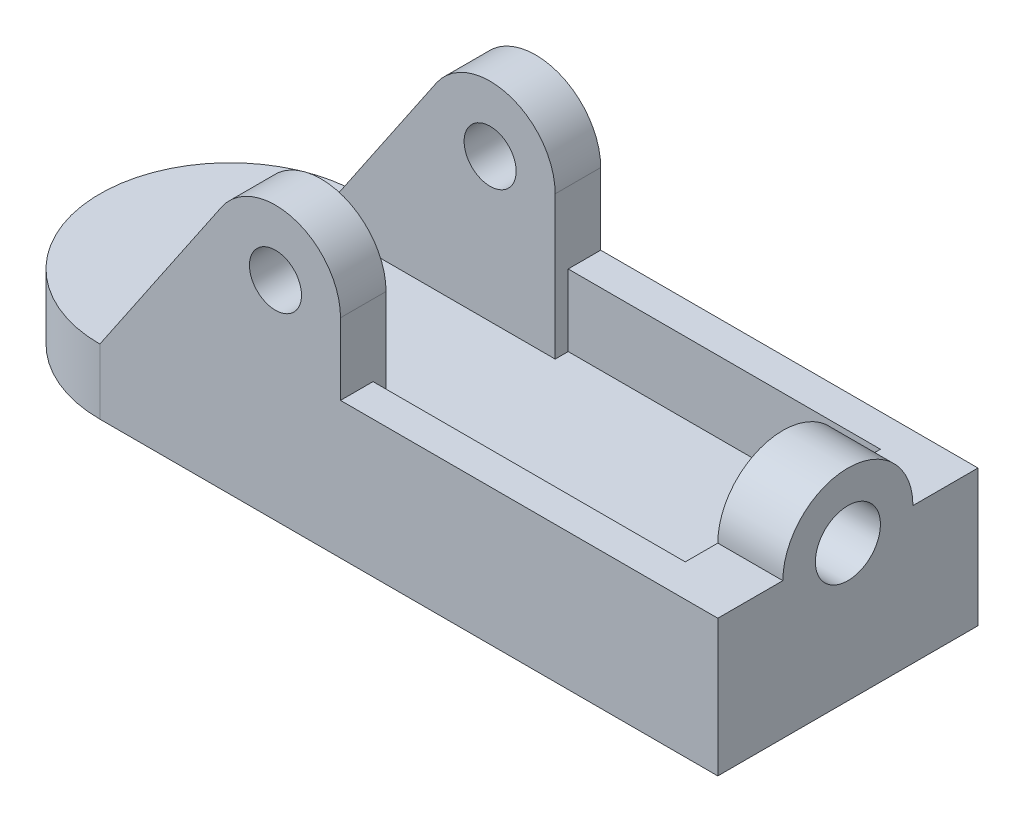
ISO-10303-21;
HEADER;
FILE_DESCRIPTION(('STEP AP214'),'2;1');
FILE_NAME('part.step','',(''),(''),'','','');
FILE_SCHEMA(('AUTOMOTIVE_DESIGN { 1 0 10303 214 1 1 1 1 }'));
ENDSEC;
DATA;
#1=APPLICATION_CONTEXT('core data for automotive mechanical design processes');
#2=APPLICATION_PROTOCOL_DEFINITION('international standard','automotive_design',2000,#1);
#3=PRODUCT_CONTEXT('',#1,'mechanical');
#4=PRODUCT('Part','Part','',(#3));
#5=PRODUCT_RELATED_PRODUCT_CATEGORY('part','',(#4));
#6=PRODUCT_DEFINITION_FORMATION('','',#4);
#7=PRODUCT_DEFINITION_CONTEXT('part definition',#1,'design');
#8=PRODUCT_DEFINITION('design','',#6,#7);
#9=PRODUCT_DEFINITION_SHAPE('','',#8);
#10=(LENGTH_UNIT() NAMED_UNIT(*) SI_UNIT(.MILLI.,.METRE.));
#11=(NAMED_UNIT(*) PLANE_ANGLE_UNIT() SI_UNIT($,.RADIAN.));
#12=(NAMED_UNIT(*) SI_UNIT($,.STERADIAN.) SOLID_ANGLE_UNIT());
#13=UNCERTAINTY_MEASURE_WITH_UNIT(LENGTH_MEASURE(1.E-05),#10,'distance_accuracy_value','');
#14=(GEOMETRIC_REPRESENTATION_CONTEXT(3) GLOBAL_UNCERTAINTY_ASSIGNED_CONTEXT((#13)) GLOBAL_UNIT_ASSIGNED_CONTEXT((#10,
#11,#12)) REPRESENTATION_CONTEXT('',''));
#15=CARTESIAN_POINT('',(0.,0.,0.));
#16=DIRECTION('',(0.,0.,1.));
#17=DIRECTION('',(1.,0.,0.));
#18=AXIS2_PLACEMENT_3D('',#15,#16,#17);
#19=CARTESIAN_POINT('',(0.,10.,0.));
#20=DIRECTION('',(0.,1.,0.));
#21=DIRECTION('',(0.,0.,1.));
#22=AXIS2_PLACEMENT_3D('',#19,#20,#21);
#23=PLANE('',#22);
#24=DIRECTION('',(0.,0.,1.));
#25=VECTOR('',#24,1.);
#26=CARTESIAN_POINT('',(85.,10.,10.));
#27=LINE('',#26,#25);
#28=CARTESIAN_POINT('',(85.,10.,-15.));
#29=VERTEX_POINT('',#28);
#30=CARTESIAN_POINT('',(85.,10.,15.));
#31=VERTEX_POINT('',#30);
#32=EDGE_CURVE('E234',#29,#31,#27,.T.);
#33=ORIENTED_EDGE('',*,*,#32,.F.);
#34=DIRECTION('',(-1.,0.,0.));
#35=VECTOR('',#34,1.);
#36=CARTESIAN_POINT('',(85.,10.,-15.));
#37=LINE('',#36,#35);
#38=CARTESIAN_POINT('',(37.,10.,-15.));
#39=VERTEX_POINT('',#38);
#40=EDGE_CURVE('E215',#29,#39,#37,.T.);
#41=ORIENTED_EDGE('',*,*,#40,.T.);
#42=DIRECTION('',(0.,0.,-1.));
#43=VECTOR('',#42,1.);
#44=CARTESIAN_POINT('',(37.,10.,-13.));
#45=LINE('',#44,#43);
#46=CARTESIAN_POINT('',(37.,10.,-13.));
#47=VERTEX_POINT('',#46);
#48=EDGE_CURVE('E284',#47,#39,#45,.T.);
#49=ORIENTED_EDGE('',*,*,#48,.F.);
#50=DIRECTION('',(1.,0.,0.));
#51=VECTOR('',#50,1.);
#52=CARTESIAN_POINT('',(0.,10.,-13.));
#53=LINE('',#52,#51);
#54=CARTESIAN_POINT('',(0.,10.,-13.));
#55=VERTEX_POINT('',#54);
#56=EDGE_CURVE('E271',#55,#47,#53,.T.);
#57=ORIENTED_EDGE('',*,*,#56,.F.);
#58=DIRECTION('',(0.,0.,-1.));
#59=VECTOR('',#58,1.);
#60=CARTESIAN_POINT('',(0.,10.,-13.));
#61=LINE('',#60,#59);
#62=CARTESIAN_POINT('',(0.,10.,-20.));
#63=VERTEX_POINT('',#62);
#64=EDGE_CURVE('E280',#55,#63,#61,.T.);
#65=ORIENTED_EDGE('',*,*,#64,.T.);
#66=CARTESIAN_POINT('',(0.,10.,0.));
#67=DIRECTION('',(0.,1.,0.));
#68=DIRECTION('',(0.,0.,1.));
#69=AXIS2_PLACEMENT_3D('',#66,#67,#68);
#70=CIRCLE('',#69,20.);
#71=CARTESIAN_POINT('',(0.,10.,20.));
#72=VERTEX_POINT('',#71);
#73=EDGE_CURVE('E358',#63,#72,#70,.T.);
#74=ORIENTED_EDGE('',*,*,#73,.T.);
#75=DIRECTION('',(0.,0.,1.));
#76=VECTOR('',#75,1.);
#77=CARTESIAN_POINT('',(0.,10.,13.));
#78=LINE('',#77,#76);
#79=CARTESIAN_POINT('',(0.,10.,13.));
#80=VERTEX_POINT('',#79);
#81=EDGE_CURVE('E311',#80,#72,#78,.T.);
#82=ORIENTED_EDGE('',*,*,#81,.F.);
#83=DIRECTION('',(1.,0.,0.));
#84=VECTOR('',#83,1.);
#85=CARTESIAN_POINT('',(0.,10.,13.));
#86=LINE('',#85,#84);
#87=CARTESIAN_POINT('',(37.,10.,13.));
#88=VERTEX_POINT('',#87);
#89=EDGE_CURVE('E301',#80,#88,#86,.T.);
#90=ORIENTED_EDGE('',*,*,#89,.T.);
#91=DIRECTION('',(0.,0.,1.));
#92=VECTOR('',#91,1.);
#93=CARTESIAN_POINT('',(37.,10.,13.));
#94=LINE('',#93,#92);
#95=CARTESIAN_POINT('',(37.,10.,15.));
#96=VERTEX_POINT('',#95);
#97=EDGE_CURVE('E324',#88,#96,#94,.T.);
#98=ORIENTED_EDGE('',*,*,#97,.T.);
#99=DIRECTION('',(-1.,0.,0.));
#100=VECTOR('',#99,1.);
#101=CARTESIAN_POINT('',(85.,10.,15.));
#102=LINE('',#101,#100);
#103=EDGE_CURVE('E68',#31,#96,#102,.T.);
#104=ORIENTED_EDGE('',*,*,#103,.F.);
#105=EDGE_LOOP('',(#33,#41,#49,#57,#65,#74,#82,#90,#98,#104));
#106=FACE_BOUND('',#105,.T.);
#107=DIRECTION('',(1.,0.,0.));
#108=VECTOR('',#107,1.);
#109=CARTESIAN_POINT('',(0.,10.,5.));
#110=LINE('',#109,#108);
#111=CARTESIAN_POINT('',(0.,10.,5.));
#112=VERTEX_POINT('',#111);
#113=CARTESIAN_POINT('',(16.8306805124505,10.,5.));
#114=VERTEX_POINT('',#113);
#115=EDGE_CURVE('E329',#112,#114,#110,.T.);
#116=ORIENTED_EDGE('',*,*,#115,.F.);
#117=CARTESIAN_POINT('',(0.,10.,0.));
#118=DIRECTION('',(0.,1.,0.));
#119=DIRECTION('',(0.,0.,1.));
#120=AXIS2_PLACEMENT_3D('',#117,#118,#119);
#121=CIRCLE('',#120,5.);
#122=CARTESIAN_POINT('',(0.,10.,-5.));
#123=VERTEX_POINT('',#122);
#124=EDGE_CURVE('E327',#123,#112,#121,.T.);
#125=ORIENTED_EDGE('',*,*,#124,.F.);
#126=DIRECTION('',(-1.,0.,0.));
#127=VECTOR('',#126,1.);
#128=CARTESIAN_POINT('',(0.,10.,-5.));
#129=LINE('',#128,#127);
#130=CARTESIAN_POINT('',(16.8306805124505,10.,-5.));
#131=VERTEX_POINT('',#130);
#132=EDGE_CURVE('E335',#131,#123,#129,.T.);
#133=ORIENTED_EDGE('',*,*,#132,.F.);
#134=CARTESIAN_POINT('',(16.8306805124505,10.,0.));
#135=DIRECTION('',(0.,1.,0.));
#136=DIRECTION('',(0.,0.,1.));
#137=AXIS2_PLACEMENT_3D('',#134,#135,#136);
#138=CIRCLE('',#137,5.);
#139=EDGE_CURVE('E332',#114,#131,#138,.T.);
#140=ORIENTED_EDGE('',*,*,#139,.F.);
#141=EDGE_LOOP('',(#116,#125,#133,#140));
#142=FACE_BOUND('',#141,.T.);
#143=ADVANCED_FACE('F45',(#106,#142),#23,.T.);
#144=CARTESIAN_POINT('',(37.,10.,13.));
#145=DIRECTION('',(1.,0.,0.));
#146=DIRECTION('',(0.,0.,-1.));
#147=AXIS2_PLACEMENT_3D('',#144,#145,#146);
#148=PLANE('',#147);
#149=DIRECTION('',(0.,0.,1.));
#150=VECTOR('',#149,1.);
#151=CARTESIAN_POINT('',(37.,21.,15.));
#152=LINE('',#151,#150);
#153=CARTESIAN_POINT('',(37.,21.,15.));
#154=VERTEX_POINT('',#153);
#155=CARTESIAN_POINT('',(37.,21.,20.));
#156=VERTEX_POINT('',#155);
#157=EDGE_CURVE('E235',#154,#156,#152,.T.);
#158=ORIENTED_EDGE('',*,*,#157,.F.);
#159=DIRECTION('',(0.,-1.,0.));
#160=VECTOR('',#159,1.);
#161=CARTESIAN_POINT('',(37.,21.,15.));
#162=LINE('',#161,#160);
#163=EDGE_CURVE('E249',#154,#96,#162,.T.);
#164=ORIENTED_EDGE('',*,*,#163,.T.);
#165=ORIENTED_EDGE('',*,*,#97,.F.);
#166=DIRECTION('',(0.,1.,0.));
#167=VECTOR('',#166,1.);
#168=CARTESIAN_POINT('',(37.,10.,13.));
#169=LINE('',#168,#167);
#170=CARTESIAN_POINT('',(37.,32.,13.));
#171=VERTEX_POINT('',#170);
#172=EDGE_CURVE('E305',#88,#171,#169,.T.);
#173=ORIENTED_EDGE('',*,*,#172,.T.);
#174=DIRECTION('',(0.,0.,1.));
#175=VECTOR('',#174,1.);
#176=CARTESIAN_POINT('',(37.,32.,13.));
#177=LINE('',#176,#175);
#178=CARTESIAN_POINT('',(37.,32.,20.));
#179=VERTEX_POINT('',#178);
#180=EDGE_CURVE('E321',#171,#179,#177,.T.);
#181=ORIENTED_EDGE('',*,*,#180,.T.);
#182=DIRECTION('',(0.,1.,0.));
#183=VECTOR('',#182,1.);
#184=CARTESIAN_POINT('',(37.,10.,20.));
#185=LINE('',#184,#183);
#186=EDGE_CURVE('E314',#156,#179,#185,.T.);
#187=ORIENTED_EDGE('',*,*,#186,.F.);
#188=EDGE_LOOP('',(#158,#164,#165,#173,#181,#187));
#189=FACE_BOUND('',#188,.T.);
#190=ADVANCED_FACE('F424',(#189),#148,.T.);
#191=CARTESIAN_POINT('',(0.,0.,0.));
#192=DIRECTION('',(0.,1.,0.));
#193=DIRECTION('',(0.,0.,1.));
#194=AXIS2_PLACEMENT_3D('',#191,#192,#193);
#195=PLANE('',#194);
#196=CARTESIAN_POINT('',(0.,0.,0.));
#197=DIRECTION('',(0.,1.,0.));
#198=DIRECTION('',(0.,0.,1.));
#199=AXIS2_PLACEMENT_3D('',#196,#197,#198);
#200=CIRCLE('',#199,20.);
#201=CARTESIAN_POINT('',(0.,0.,-20.));
#202=VERTEX_POINT('',#201);
#203=CARTESIAN_POINT('',(0.,0.,20.));
#204=VERTEX_POINT('',#203);
#205=EDGE_CURVE('E357',#202,#204,#200,.T.);
#206=ORIENTED_EDGE('',*,*,#205,.F.);
#207=DIRECTION('',(-1.,0.,0.));
#208=VECTOR('',#207,1.);
#209=CARTESIAN_POINT('',(95.,0.,-20.));
#210=LINE('',#209,#208);
#211=CARTESIAN_POINT('',(95.,0.,-20.));
#212=VERTEX_POINT('',#211);
#213=EDGE_CURVE('E362',#212,#202,#210,.T.);
#214=ORIENTED_EDGE('',*,*,#213,.F.);
#215=DIRECTION('',(0.,0.,-1.));
#216=VECTOR('',#215,1.);
#217=CARTESIAN_POINT('',(95.,0.,20.));
#218=LINE('',#217,#216);
#219=CARTESIAN_POINT('',(95.,0.,20.));
#220=VERTEX_POINT('',#219);
#221=EDGE_CURVE('E367',#220,#212,#218,.T.);
#222=ORIENTED_EDGE('',*,*,#221,.F.);
#223=DIRECTION('',(1.,0.,0.));
#224=VECTOR('',#223,1.);
#225=CARTESIAN_POINT('',(0.,0.,20.));
#226=LINE('',#225,#224);
#227=EDGE_CURVE('E365',#204,#220,#226,.T.);
#228=ORIENTED_EDGE('',*,*,#227,.F.);
#229=EDGE_LOOP('',(#206,#214,#222,#228));
#230=FACE_BOUND('',#229,.T.);
#231=CARTESIAN_POINT('',(0.,0.,0.));
#232=DIRECTION('',(0.,1.,0.));
#233=DIRECTION('',(0.,0.,1.));
#234=AXIS2_PLACEMENT_3D('',#231,#232,#233);
#235=CIRCLE('',#234,5.);
#236=CARTESIAN_POINT('',(0.,0.,-5.));
#237=VERTEX_POINT('',#236);
#238=CARTESIAN_POINT('',(0.,0.,5.));
#239=VERTEX_POINT('',#238);
#240=EDGE_CURVE('E320',#237,#239,#235,.T.);
#241=ORIENTED_EDGE('',*,*,#240,.T.);
#242=DIRECTION('',(1.,0.,0.));
#243=VECTOR('',#242,1.);
#244=CARTESIAN_POINT('',(0.,0.,5.));
#245=LINE('',#244,#243);
#246=CARTESIAN_POINT('',(16.8306805124505,0.,5.));
#247=VERTEX_POINT('',#246);
#248=EDGE_CURVE('E340',#239,#247,#245,.T.);
#249=ORIENTED_EDGE('',*,*,#248,.T.);
#250=CARTESIAN_POINT('',(16.8306805124505,0.,0.));
#251=DIRECTION('',(0.,1.,0.));
#252=DIRECTION('',(0.,0.,1.));
#253=AXIS2_PLACEMENT_3D('',#250,#251,#252);
#254=CIRCLE('',#253,5.);
#255=CARTESIAN_POINT('',(16.8306805124505,0.,-5.));
#256=VERTEX_POINT('',#255);
#257=EDGE_CURVE('E343',#247,#256,#254,.T.);
#258=ORIENTED_EDGE('',*,*,#257,.T.);
#259=DIRECTION('',(-1.,0.,0.));
#260=VECTOR('',#259,1.);
#261=CARTESIAN_POINT('',(0.,0.,-5.));
#262=LINE('',#261,#260);
#263=EDGE_CURVE('E330',#256,#237,#262,.T.);
#264=ORIENTED_EDGE('',*,*,#263,.T.);
#265=EDGE_LOOP('',(#241,#249,#258,#264));
#266=FACE_BOUND('',#265,.T.);
#267=ADVANCED_FACE('F385',(#230,#266),#195,.F.);
#268=CARTESIAN_POINT('',(0.,10.,0.));
#269=DIRECTION('',(0.,-1.,0.));
#270=DIRECTION('',(0.,0.,-1.));
#271=AXIS2_PLACEMENT_3D('',#268,#269,#270);
#272=CYLINDRICAL_SURFACE('',#271,20.);
#273=ORIENTED_EDGE('',*,*,#205,.T.);
#274=DIRECTION('',(0.,-1.,0.));
#275=VECTOR('',#274,1.);
#276=CARTESIAN_POINT('',(0.,10.,20.));
#277=LINE('',#276,#275);
#278=EDGE_CURVE('E13',#72,#204,#277,.T.);
#279=ORIENTED_EDGE('',*,*,#278,.F.);
#280=ORIENTED_EDGE('',*,*,#73,.F.);
#281=DIRECTION('',(0.,-1.,0.));
#282=VECTOR('',#281,1.);
#283=CARTESIAN_POINT('',(0.,10.,-20.));
#284=LINE('',#283,#282);
#285=EDGE_CURVE('E361',#63,#202,#284,.T.);
#286=ORIENTED_EDGE('',*,*,#285,.T.);
#287=EDGE_LOOP('',(#273,#279,#280,#286));
#288=FACE_BOUND('',#287,.T.);
#289=ADVANCED_FACE('F47',(#288),#272,.T.);
#290=CARTESIAN_POINT('',(0.,10.,20.));
#291=DIRECTION('',(0.,0.,-1.));
#292=DIRECTION('',(-1.,0.,0.));
#293=AXIS2_PLACEMENT_3D('',#290,#291,#292);
#294=PLANE('',#293);
#295=DIRECTION('',(0.,-1.,0.));
#296=VECTOR('',#295,1.);
#297=CARTESIAN_POINT('',(95.,10.,20.));
#298=LINE('',#297,#296);
#299=CARTESIAN_POINT('',(95.,21.,20.));
#300=VERTEX_POINT('',#299);
#301=EDGE_CURVE('E53',#300,#220,#298,.T.);
#302=ORIENTED_EDGE('',*,*,#301,.F.);
#303=DIRECTION('',(1.,0.,0.));
#304=VECTOR('',#303,1.);
#305=CARTESIAN_POINT('',(37.,21.,20.));
#306=LINE('',#305,#304);
#307=EDGE_CURVE('E238',#156,#300,#306,.T.);
#308=ORIENTED_EDGE('',*,*,#307,.F.);
#309=ORIENTED_EDGE('',*,*,#186,.T.);
#310=CARTESIAN_POINT('',(27.,32.,20.));
#311=DIRECTION('',(0.,0.,1.));
#312=DIRECTION('',(1.,0.,0.));
#313=AXIS2_PLACEMENT_3D('',#310,#311,#312);
#314=CIRCLE('',#313,10.);
#315=CARTESIAN_POINT('',(18.7233602475273,37.6122396962165,20.));
#316=VERTEX_POINT('',#315);
#317=EDGE_CURVE('E302',#179,#316,#314,.T.);
#318=ORIENTED_EDGE('',*,*,#317,.T.);
#319=DIRECTION('',(-0.561223969621651,-0.827663975247271,0.));
#320=VECTOR('',#319,1.);
#321=CARTESIAN_POINT('',(0.,10.,20.));
#322=LINE('',#321,#320);
#323=EDGE_CURVE('E295',#316,#72,#322,.T.);
#324=ORIENTED_EDGE('',*,*,#323,.T.);
#325=ORIENTED_EDGE('',*,*,#278,.T.);
#326=ORIENTED_EDGE('',*,*,#227,.T.);
#327=EDGE_LOOP('',(#302,#308,#309,#318,#324,#325,#326));
#328=FACE_BOUND('',#327,.T.);
#329=CARTESIAN_POINT('',(27.,32.,20.));
#330=DIRECTION('',(0.,0.,1.));
#331=DIRECTION('',(1.,0.,0.));
#332=AXIS2_PLACEMENT_3D('',#329,#330,#331);
#333=CIRCLE('',#332,4.);
#334=CARTESIAN_POINT('',(31.,32.,20.));
#335=VERTEX_POINT('',#334);
#336=EDGE_CURVE('E283',#335,#335,#333,.T.);
#337=ORIENTED_EDGE('',*,*,#336,.F.);
#338=EDGE_LOOP('',(#337));
#339=FACE_BOUND('',#338,.T.);
#340=ADVANCED_FACE('F420',(#328,#339),#294,.F.);
#341=CARTESIAN_POINT('',(95.,10.,20.));
#342=DIRECTION('',(-1.,0.,0.));
#343=DIRECTION('',(0.,0.,1.));
#344=AXIS2_PLACEMENT_3D('',#341,#342,#343);
#345=PLANE('',#344);
#346=ORIENTED_EDGE('',*,*,#221,.T.);
#347=DIRECTION('',(0.,-1.,0.));
#348=VECTOR('',#347,1.);
#349=CARTESIAN_POINT('',(95.,10.,-20.));
#350=LINE('',#349,#348);
#351=CARTESIAN_POINT('',(95.,21.,-20.));
#352=VERTEX_POINT('',#351);
#353=EDGE_CURVE('E372',#352,#212,#350,.T.);
#354=ORIENTED_EDGE('',*,*,#353,.F.);
#355=DIRECTION('',(0.,0.,1.));
#356=VECTOR('',#355,1.);
#357=CARTESIAN_POINT('',(95.,21.,-20.));
#358=LINE('',#357,#356);
#359=CARTESIAN_POINT('',(95.,21.,-10.));
#360=VERTEX_POINT('',#359);
#361=EDGE_CURVE('E208',#352,#360,#358,.T.);
#362=ORIENTED_EDGE('',*,*,#361,.T.);
#363=CARTESIAN_POINT('',(95.,21.,0.));
#364=DIRECTION('',(1.,0.,0.));
#365=DIRECTION('',(0.,0.,1.));
#366=AXIS2_PLACEMENT_3D('',#363,#364,#365);
#367=CIRCLE('',#366,10.);
#368=CARTESIAN_POINT('',(95.,21.,10.));
#369=VERTEX_POINT('',#368);
#370=EDGE_CURVE('E207',#360,#369,#367,.T.);
#371=ORIENTED_EDGE('',*,*,#370,.T.);
#372=DIRECTION('',(0.,0.,-1.));
#373=VECTOR('',#372,1.);
#374=CARTESIAN_POINT('',(95.,21.,20.));
#375=LINE('',#374,#373);
#376=EDGE_CURVE('E241',#300,#369,#375,.T.);
#377=ORIENTED_EDGE('',*,*,#376,.F.);
#378=ORIENTED_EDGE('',*,*,#301,.T.);
#379=EDGE_LOOP('',(#346,#354,#362,#371,#377,#378));
#380=FACE_BOUND('',#379,.T.);
#381=CARTESIAN_POINT('',(95.,21.,0.));
#382=DIRECTION('',(1.,0.,0.));
#383=DIRECTION('',(0.,0.,-1.));
#384=AXIS2_PLACEMENT_3D('',#381,#382,#383);
#385=CIRCLE('',#384,5.);
#386=CARTESIAN_POINT('',(95.,21.,-5.));
#387=VERTEX_POINT('',#386);
#388=EDGE_CURVE('E223',#387,#387,#385,.T.);
#389=ORIENTED_EDGE('',*,*,#388,.F.);
#390=EDGE_LOOP('',(#389));
#391=FACE_BOUND('',#390,.T.);
#392=ADVANCED_FACE('F378',(#380,#391),#345,.F.);
#393=CARTESIAN_POINT('',(95.,10.,-20.));
#394=DIRECTION('',(0.,0.,1.));
#395=DIRECTION('',(1.,0.,0.));
#396=AXIS2_PLACEMENT_3D('',#393,#394,#395);
#397=PLANE('',#396);
#398=ORIENTED_EDGE('',*,*,#213,.T.);
#399=ORIENTED_EDGE('',*,*,#285,.F.);
#400=DIRECTION('',(-0.561223969621651,-0.827663975247271,0.));
#401=VECTOR('',#400,1.);
#402=CARTESIAN_POINT('',(0.,10.,-20.));
#403=LINE('',#402,#401);
#404=CARTESIAN_POINT('',(18.7233602475273,37.6122396962165,-20.));
#405=VERTEX_POINT('',#404);
#406=EDGE_CURVE('E260',#405,#63,#403,.T.);
#407=ORIENTED_EDGE('',*,*,#406,.F.);
#408=CARTESIAN_POINT('',(27.,32.,-20.));
#409=DIRECTION('',(0.,0.,1.));
#410=DIRECTION('',(1.,0.,0.));
#411=AXIS2_PLACEMENT_3D('',#408,#409,#410);
#412=CIRCLE('',#411,10.);
#413=CARTESIAN_POINT('',(37.,32.,-20.));
#414=VERTEX_POINT('',#413);
#415=EDGE_CURVE('E277',#414,#405,#412,.T.);
#416=ORIENTED_EDGE('',*,*,#415,.F.);
#417=DIRECTION('',(0.,1.,0.));
#418=VECTOR('',#417,1.);
#419=CARTESIAN_POINT('',(37.,10.,-20.));
#420=LINE('',#419,#418);
#421=CARTESIAN_POINT('',(37.,21.,-20.));
#422=VERTEX_POINT('',#421);
#423=EDGE_CURVE('E267',#422,#414,#420,.T.);
#424=ORIENTED_EDGE('',*,*,#423,.F.);
#425=DIRECTION('',(1.,0.,0.));
#426=VECTOR('',#425,1.);
#427=CARTESIAN_POINT('',(37.,21.,-20.));
#428=LINE('',#427,#426);
#429=EDGE_CURVE('E60',#422,#352,#428,.T.);
#430=ORIENTED_EDGE('',*,*,#429,.T.);
#431=ORIENTED_EDGE('',*,*,#353,.T.);
#432=EDGE_LOOP('',(#398,#399,#407,#416,#424,#430,#431));
#433=FACE_BOUND('',#432,.T.);
#434=CARTESIAN_POINT('',(27.,32.,-20.));
#435=DIRECTION('',(0.,0.,1.));
#436=DIRECTION('',(1.,0.,0.));
#437=AXIS2_PLACEMENT_3D('',#434,#435,#436);
#438=CIRCLE('',#437,4.);
#439=CARTESIAN_POINT('',(31.,32.,-20.));
#440=VERTEX_POINT('',#439);
#441=EDGE_CURVE('E256',#440,#440,#438,.T.);
#442=ORIENTED_EDGE('',*,*,#441,.T.);
#443=EDGE_LOOP('',(#442));
#444=FACE_BOUND('',#443,.T.);
#445=ADVANCED_FACE('F389',(#433,#444),#397,.F.);
#446=CARTESIAN_POINT('',(0.,10.,0.));
#447=DIRECTION('',(0.,-1.,0.));
#448=DIRECTION('',(0.,0.,-1.));
#449=AXIS2_PLACEMENT_3D('',#446,#447,#448);
#450=CYLINDRICAL_SURFACE('',#449,5.);
#451=ORIENTED_EDGE('',*,*,#240,.F.);
#452=DIRECTION('',(0.,-1.,0.));
#453=VECTOR('',#452,1.);
#454=CARTESIAN_POINT('',(0.,10.,-5.));
#455=LINE('',#454,#453);
#456=EDGE_CURVE('E337',#123,#237,#455,.T.);
#457=ORIENTED_EDGE('',*,*,#456,.F.);
#458=ORIENTED_EDGE('',*,*,#124,.T.);
#459=DIRECTION('',(0.,-1.,0.));
#460=VECTOR('',#459,1.);
#461=CARTESIAN_POINT('',(0.,10.,5.));
#462=LINE('',#461,#460);
#463=EDGE_CURVE('E354',#112,#239,#462,.T.);
#464=ORIENTED_EDGE('',*,*,#463,.T.);
#465=EDGE_LOOP('',(#451,#457,#458,#464));
#466=FACE_BOUND('',#465,.T.);
#467=ADVANCED_FACE('F455',(#466),#450,.F.);
#468=CARTESIAN_POINT('',(0.,10.,5.));
#469=DIRECTION('',(0.,0.,-1.));
#470=DIRECTION('',(-1.,0.,0.));
#471=AXIS2_PLACEMENT_3D('',#468,#469,#470);
#472=PLANE('',#471);
#473=ORIENTED_EDGE('',*,*,#248,.F.);
#474=ORIENTED_EDGE('',*,*,#463,.F.);
#475=ORIENTED_EDGE('',*,*,#115,.T.);
#476=DIRECTION('',(0.,-1.,0.));
#477=VECTOR('',#476,1.);
#478=CARTESIAN_POINT('',(16.8306805124505,10.,5.));
#479=LINE('',#478,#477);
#480=EDGE_CURVE('E352',#114,#247,#479,.T.);
#481=ORIENTED_EDGE('',*,*,#480,.T.);
#482=EDGE_LOOP('',(#473,#474,#475,#481));
#483=FACE_BOUND('',#482,.T.);
#484=ADVANCED_FACE('F637',(#483),#472,.T.);
#485=CARTESIAN_POINT('',(16.8306805124505,10.,0.));
#486=DIRECTION('',(0.,-1.,0.));
#487=DIRECTION('',(0.,0.,-1.));
#488=AXIS2_PLACEMENT_3D('',#485,#486,#487);
#489=CYLINDRICAL_SURFACE('',#488,5.);
#490=ORIENTED_EDGE('',*,*,#257,.F.);
#491=ORIENTED_EDGE('',*,*,#480,.F.);
#492=ORIENTED_EDGE('',*,*,#139,.T.);
#493=DIRECTION('',(0.,-1.,0.));
#494=VECTOR('',#493,1.);
#495=CARTESIAN_POINT('',(16.8306805124505,10.,-5.));
#496=LINE('',#495,#494);
#497=EDGE_CURVE('E350',#131,#256,#496,.T.);
#498=ORIENTED_EDGE('',*,*,#497,.T.);
#499=EDGE_LOOP('',(#490,#491,#492,#498));
#500=FACE_BOUND('',#499,.T.);
#501=ADVANCED_FACE('F629',(#500),#489,.F.);
#502=CARTESIAN_POINT('',(0.,10.,-5.));
#503=DIRECTION('',(0.,0.,1.));
#504=DIRECTION('',(1.,0.,0.));
#505=AXIS2_PLACEMENT_3D('',#502,#503,#504);
#506=PLANE('',#505);
#507=ORIENTED_EDGE('',*,*,#263,.F.);
#508=ORIENTED_EDGE('',*,*,#497,.F.);
#509=ORIENTED_EDGE('',*,*,#132,.T.);
#510=ORIENTED_EDGE('',*,*,#456,.T.);
#511=EDGE_LOOP('',(#507,#508,#509,#510));
#512=FACE_BOUND('',#511,.T.);
#513=ADVANCED_FACE('F621',(#512),#506,.T.);
#514=CARTESIAN_POINT('',(0.,10.,13.));
#515=DIRECTION('',(-0.827663975247271,0.561223969621651,0.));
#516=DIRECTION('',(-0.561223969621651,-0.827663975247271,0.));
#517=AXIS2_PLACEMENT_3D('',#514,#515,#516);
#518=PLANE('',#517);
#519=ORIENTED_EDGE('',*,*,#323,.F.);
#520=DIRECTION('',(0.,0.,1.));
#521=VECTOR('',#520,1.);
#522=CARTESIAN_POINT('',(18.7233602475273,37.6122396962165,13.));
#523=LINE('',#522,#521);
#524=CARTESIAN_POINT('',(18.7233602475273,37.6122396962165,13.));
#525=VERTEX_POINT('',#524);
#526=EDGE_CURVE('E318',#525,#316,#523,.T.);
#527=ORIENTED_EDGE('',*,*,#526,.F.);
#528=DIRECTION('',(-0.561223969621651,-0.827663975247271,0.));
#529=VECTOR('',#528,1.);
#530=CARTESIAN_POINT('',(0.,10.,13.));
#531=LINE('',#530,#529);
#532=EDGE_CURVE('E298',#525,#80,#531,.T.);
#533=ORIENTED_EDGE('',*,*,#532,.T.);
#534=ORIENTED_EDGE('',*,*,#81,.T.);
#535=EDGE_LOOP('',(#519,#527,#533,#534));
#536=FACE_BOUND('',#535,.T.);
#537=ADVANCED_FACE('F432',(#536),#518,.T.);
#538=CARTESIAN_POINT('',(27.,32.,13.));
#539=DIRECTION('',(0.,0.,1.));
#540=DIRECTION('',(1.,0.,0.));
#541=AXIS2_PLACEMENT_3D('',#538,#539,#540);
#542=CYLINDRICAL_SURFACE('',#541,10.);
#543=ORIENTED_EDGE('',*,*,#317,.F.);
#544=ORIENTED_EDGE('',*,*,#180,.F.);
#545=CARTESIAN_POINT('',(27.,32.,13.));
#546=DIRECTION('',(0.,0.,1.));
#547=DIRECTION('',(1.,0.,0.));
#548=AXIS2_PLACEMENT_3D('',#545,#546,#547);
#549=CIRCLE('',#548,10.);
#550=EDGE_CURVE('E308',#171,#525,#549,.T.);
#551=ORIENTED_EDGE('',*,*,#550,.T.);
#552=ORIENTED_EDGE('',*,*,#526,.T.);
#553=EDGE_LOOP('',(#543,#544,#551,#552));
#554=FACE_BOUND('',#553,.T.);
#555=ADVANCED_FACE('F428',(#554),#542,.T.);
#556=CARTESIAN_POINT('',(27.,32.,13.));
#557=DIRECTION('',(0.,0.,1.));
#558=DIRECTION('',(1.,0.,0.));
#559=AXIS2_PLACEMENT_3D('',#556,#557,#558);
#560=PLANE('',#559);
#561=CARTESIAN_POINT('',(27.,32.,13.));
#562=DIRECTION('',(0.,0.,1.));
#563=DIRECTION('',(1.,0.,0.));
#564=AXIS2_PLACEMENT_3D('',#561,#562,#563);
#565=CIRCLE('',#564,4.);
#566=CARTESIAN_POINT('',(31.,32.,13.));
#567=VERTEX_POINT('',#566);
#568=EDGE_CURVE('E292',#567,#567,#565,.T.);
#569=ORIENTED_EDGE('',*,*,#568,.T.);
#570=EDGE_LOOP('',(#569));
#571=FACE_BOUND('',#570,.T.);
#572=ORIENTED_EDGE('',*,*,#532,.F.);
#573=ORIENTED_EDGE('',*,*,#550,.F.);
#574=ORIENTED_EDGE('',*,*,#172,.F.);
#575=ORIENTED_EDGE('',*,*,#89,.F.);
#576=EDGE_LOOP('',(#572,#573,#574,#575));
#577=FACE_BOUND('',#576,.T.);
#578=ADVANCED_FACE('F434',(#571,#577),#560,.F.);
#579=CARTESIAN_POINT('',(27.,32.,13.));
#580=DIRECTION('',(0.,0.,1.));
#581=DIRECTION('',(1.,0.,0.));
#582=AXIS2_PLACEMENT_3D('',#579,#580,#581);
#583=CYLINDRICAL_SURFACE('',#582,4.);
#584=ORIENTED_EDGE('',*,*,#568,.F.);
#585=EDGE_LOOP('',(#584));
#586=FACE_BOUND('',#585,.T.);
#587=ORIENTED_EDGE('',*,*,#336,.T.);
#588=EDGE_LOOP('',(#587));
#589=FACE_BOUND('',#588,.T.);
#590=ADVANCED_FACE('F436',(#586,#589),#583,.F.);
#591=CARTESIAN_POINT('',(27.,32.,-13.));
#592=DIRECTION('',(0.,0.,-1.));
#593=DIRECTION('',(1.,0.,0.));
#594=AXIS2_PLACEMENT_3D('',#591,#592,#593);
#595=PLANE('',#594);
#596=DIRECTION('',(-0.561223969621651,-0.827663975247271,0.));
#597=VECTOR('',#596,1.);
#598=CARTESIAN_POINT('',(0.,10.,-13.));
#599=LINE('',#598,#597);
#600=CARTESIAN_POINT('',(18.7233602475273,37.6122396962165,-13.));
#601=VERTEX_POINT('',#600);
#602=EDGE_CURVE('E263',#601,#55,#599,.T.);
#603=ORIENTED_EDGE('',*,*,#602,.T.);
#604=ORIENTED_EDGE('',*,*,#56,.T.);
#605=DIRECTION('',(0.,1.,0.));
#606=VECTOR('',#605,1.);
#607=CARTESIAN_POINT('',(37.,10.,-13.));
#608=LINE('',#607,#606);
#609=CARTESIAN_POINT('',(37.,32.,-13.));
#610=VERTEX_POINT('',#609);
#611=EDGE_CURVE('E269',#47,#610,#608,.T.);
#612=ORIENTED_EDGE('',*,*,#611,.T.);
#613=CARTESIAN_POINT('',(27.,32.,-13.));
#614=DIRECTION('',(0.,0.,1.));
#615=DIRECTION('',(1.,0.,0.));
#616=AXIS2_PLACEMENT_3D('',#613,#614,#615);
#617=CIRCLE('',#616,10.);
#618=EDGE_CURVE('E266',#610,#601,#617,.T.);
#619=ORIENTED_EDGE('',*,*,#618,.T.);
#620=EDGE_LOOP('',(#603,#604,#612,#619));
#621=FACE_BOUND('',#620,.T.);
#622=CARTESIAN_POINT('',(27.,32.,-13.));
#623=DIRECTION('',(0.,0.,1.));
#624=DIRECTION('',(1.,0.,0.));
#625=AXIS2_PLACEMENT_3D('',#622,#623,#624);
#626=CIRCLE('',#625,4.);
#627=CARTESIAN_POINT('',(31.,32.,-13.));
#628=VERTEX_POINT('',#627);
#629=EDGE_CURVE('E257',#628,#628,#626,.T.);
#630=ORIENTED_EDGE('',*,*,#629,.F.);
#631=EDGE_LOOP('',(#630));
#632=FACE_BOUND('',#631,.T.);
#633=ADVANCED_FACE('F443',(#621,#632),#595,.F.);
#634=CARTESIAN_POINT('',(0.,10.,-13.));
#635=DIRECTION('',(0.827663975247271,-0.561223969621651,0.));
#636=DIRECTION('',(0.561223969621651,0.827663975247271,0.));
#637=AXIS2_PLACEMENT_3D('',#634,#635,#636);
#638=PLANE('',#637);
#639=ORIENTED_EDGE('',*,*,#406,.T.);
#640=ORIENTED_EDGE('',*,*,#64,.F.);
#641=ORIENTED_EDGE('',*,*,#602,.F.);
#642=DIRECTION('',(0.,0.,-1.));
#643=VECTOR('',#642,1.);
#644=CARTESIAN_POINT('',(18.7233602475273,37.6122396962165,-13.));
#645=LINE('',#644,#643);
#646=EDGE_CURVE('E274',#601,#405,#645,.T.);
#647=ORIENTED_EDGE('',*,*,#646,.T.);
#648=EDGE_LOOP('',(#639,#640,#641,#647));
#649=FACE_BOUND('',#648,.T.);
#650=ADVANCED_FACE('F399',(#649),#638,.F.);
#651=CARTESIAN_POINT('',(37.,10.,-13.));
#652=DIRECTION('',(-1.,0.,0.));
#653=DIRECTION('',(0.,0.,1.));
#654=AXIS2_PLACEMENT_3D('',#651,#652,#653);
#655=PLANE('',#654);
#656=ORIENTED_EDGE('',*,*,#48,.T.);
#657=DIRECTION('',(0.,-1.,0.));
#658=VECTOR('',#657,1.);
#659=CARTESIAN_POINT('',(37.,21.,-15.));
#660=LINE('',#659,#658);
#661=CARTESIAN_POINT('',(37.,21.,-15.));
#662=VERTEX_POINT('',#661);
#663=EDGE_CURVE('E232',#662,#39,#660,.T.);
#664=ORIENTED_EDGE('',*,*,#663,.F.);
#665=DIRECTION('',(0.,0.,-1.));
#666=VECTOR('',#665,1.);
#667=CARTESIAN_POINT('',(37.,21.,-15.));
#668=LINE('',#667,#666);
#669=EDGE_CURVE('E218',#662,#422,#668,.T.);
#670=ORIENTED_EDGE('',*,*,#669,.T.);
#671=ORIENTED_EDGE('',*,*,#423,.T.);
#672=DIRECTION('',(0.,0.,-1.));
#673=VECTOR('',#672,1.);
#674=CARTESIAN_POINT('',(37.,32.,-13.));
#675=LINE('',#674,#673);
#676=EDGE_CURVE('E287',#610,#414,#675,.T.);
#677=ORIENTED_EDGE('',*,*,#676,.F.);
#678=ORIENTED_EDGE('',*,*,#611,.F.);
#679=EDGE_LOOP('',(#656,#664,#670,#671,#677,#678));
#680=FACE_BOUND('',#679,.T.);
#681=ADVANCED_FACE('F409',(#680),#655,.F.);
#682=CARTESIAN_POINT('',(27.,32.,-13.));
#683=DIRECTION('',(0.,0.,-1.));
#684=DIRECTION('',(-1.,0.,0.));
#685=AXIS2_PLACEMENT_3D('',#682,#683,#684);
#686=CYLINDRICAL_SURFACE('',#685,10.);
#687=ORIENTED_EDGE('',*,*,#415,.T.);
#688=ORIENTED_EDGE('',*,*,#646,.F.);
#689=ORIENTED_EDGE('',*,*,#618,.F.);
#690=ORIENTED_EDGE('',*,*,#676,.T.);
#691=EDGE_LOOP('',(#687,#688,#689,#690));
#692=FACE_BOUND('',#691,.T.);
#693=ADVANCED_FACE('F404',(#692),#686,.T.);
#694=CARTESIAN_POINT('',(27.,32.,-13.));
#695=DIRECTION('',(0.,0.,-1.));
#696=DIRECTION('',(-1.,0.,0.));
#697=AXIS2_PLACEMENT_3D('',#694,#695,#696);
#698=CYLINDRICAL_SURFACE('',#697,4.);
#699=ORIENTED_EDGE('',*,*,#629,.T.);
#700=EDGE_LOOP('',(#699));
#701=FACE_BOUND('',#700,.T.);
#702=ORIENTED_EDGE('',*,*,#441,.F.);
#703=EDGE_LOOP('',(#702));
#704=FACE_BOUND('',#703,.T.);
#705=ADVANCED_FACE('F486',(#701,#704),#698,.F.);
#706=CARTESIAN_POINT('',(85.,21.,10.));
#707=DIRECTION('',(1.,0.,0.));
#708=DIRECTION('',(0.,0.,-1.));
#709=AXIS2_PLACEMENT_3D('',#706,#707,#708);
#710=PLANE('',#709);
#711=ORIENTED_EDGE('',*,*,#32,.T.);
#712=DIRECTION('',(0.,-1.,0.));
#713=VECTOR('',#712,1.);
#714=CARTESIAN_POINT('',(85.,21.,15.));
#715=LINE('',#714,#713);
#716=CARTESIAN_POINT('',(85.,21.,15.));
#717=VERTEX_POINT('',#716);
#718=EDGE_CURVE('E253',#717,#31,#715,.T.);
#719=ORIENTED_EDGE('',*,*,#718,.F.);
#720=DIRECTION('',(0.,0.,1.));
#721=VECTOR('',#720,1.);
#722=CARTESIAN_POINT('',(85.,21.,10.));
#723=LINE('',#722,#721);
#724=CARTESIAN_POINT('',(85.,21.,10.));
#725=VERTEX_POINT('',#724);
#726=EDGE_CURVE('E214',#725,#717,#723,.T.);
#727=ORIENTED_EDGE('',*,*,#726,.F.);
#728=CARTESIAN_POINT('',(85.,21.,0.));
#729=DIRECTION('',(1.,0.,0.));
#730=DIRECTION('',(0.,0.,1.));
#731=AXIS2_PLACEMENT_3D('',#728,#729,#730);
#732=CIRCLE('',#731,10.);
#733=CARTESIAN_POINT('',(85.,21.,-10.));
#734=VERTEX_POINT('',#733);
#735=EDGE_CURVE('E205',#734,#725,#732,.T.);
#736=ORIENTED_EDGE('',*,*,#735,.F.);
#737=DIRECTION('',(0.,0.,-1.));
#738=VECTOR('',#737,1.);
#739=CARTESIAN_POINT('',(85.,21.,-10.));
#740=LINE('',#739,#738);
#741=CARTESIAN_POINT('',(85.,21.,-15.));
#742=VERTEX_POINT('',#741);
#743=EDGE_CURVE('E189',#734,#742,#740,.T.);
#744=ORIENTED_EDGE('',*,*,#743,.T.);
#745=DIRECTION('',(0.,-1.,0.));
#746=VECTOR('',#745,1.);
#747=CARTESIAN_POINT('',(85.,21.,-15.));
#748=LINE('',#747,#746);
#749=EDGE_CURVE('E229',#742,#29,#748,.T.);
#750=ORIENTED_EDGE('',*,*,#749,.T.);
#751=EDGE_LOOP('',(#711,#719,#727,#736,#744,#750));
#752=FACE_BOUND('',#751,.T.);
#753=CARTESIAN_POINT('',(85.,21.,0.));
#754=DIRECTION('',(1.,0.,0.));
#755=DIRECTION('',(0.,0.,-1.));
#756=AXIS2_PLACEMENT_3D('',#753,#754,#755);
#757=CIRCLE('',#756,5.);
#758=CARTESIAN_POINT('',(85.,21.,-5.));
#759=VERTEX_POINT('',#758);
#760=EDGE_CURVE('E220',#759,#759,#757,.T.);
#761=ORIENTED_EDGE('',*,*,#760,.T.);
#762=EDGE_LOOP('',(#761));
#763=FACE_BOUND('',#762,.T.);
#764=ADVANCED_FACE('F211',(#752,#763),#710,.F.);
#765=CARTESIAN_POINT('',(85.,21.,15.));
#766=DIRECTION('',(0.,0.,1.));
#767=DIRECTION('',(1.,0.,0.));
#768=AXIS2_PLACEMENT_3D('',#765,#766,#767);
#769=PLANE('',#768);
#770=ORIENTED_EDGE('',*,*,#103,.T.);
#771=ORIENTED_EDGE('',*,*,#163,.F.);
#772=DIRECTION('',(-1.,0.,0.));
#773=VECTOR('',#772,1.);
#774=CARTESIAN_POINT('',(85.,21.,15.));
#775=LINE('',#774,#773);
#776=EDGE_CURVE('E246',#717,#154,#775,.T.);
#777=ORIENTED_EDGE('',*,*,#776,.F.);
#778=ORIENTED_EDGE('',*,*,#718,.T.);
#779=EDGE_LOOP('',(#770,#771,#777,#778));
#780=FACE_BOUND('',#779,.T.);
#781=ADVANCED_FACE('F416',(#780),#769,.F.);
#782=CARTESIAN_POINT('',(0.,21.,0.));
#783=DIRECTION('',(0.,1.,0.));
#784=DIRECTION('',(0.,0.,1.));
#785=AXIS2_PLACEMENT_3D('',#782,#783,#784);
#786=PLANE('',#785);
#787=ORIENTED_EDGE('',*,*,#157,.T.);
#788=ORIENTED_EDGE('',*,*,#307,.T.);
#789=ORIENTED_EDGE('',*,*,#376,.T.);
#790=DIRECTION('',(-1.,0.,0.));
#791=VECTOR('',#790,1.);
#792=CARTESIAN_POINT('',(95.,21.,10.));
#793=LINE('',#792,#791);
#794=EDGE_CURVE('E243',#369,#725,#793,.T.);
#795=ORIENTED_EDGE('',*,*,#794,.T.);
#796=ORIENTED_EDGE('',*,*,#726,.T.);
#797=ORIENTED_EDGE('',*,*,#776,.T.);
#798=EDGE_LOOP('',(#787,#788,#789,#795,#796,#797));
#799=FACE_BOUND('',#798,.T.);
#800=ADVANCED_FACE('F419',(#799),#786,.T.);
#801=CARTESIAN_POINT('',(85.,21.,-15.));
#802=DIRECTION('',(0.,0.,1.));
#803=DIRECTION('',(1.,0.,0.));
#804=AXIS2_PLACEMENT_3D('',#801,#802,#803);
#805=PLANE('',#804);
#806=ORIENTED_EDGE('',*,*,#40,.F.);
#807=ORIENTED_EDGE('',*,*,#749,.F.);
#808=DIRECTION('',(-1.,0.,0.));
#809=VECTOR('',#808,1.);
#810=CARTESIAN_POINT('',(85.,21.,-15.));
#811=LINE('',#810,#809);
#812=EDGE_CURVE('E195',#742,#662,#811,.T.);
#813=ORIENTED_EDGE('',*,*,#812,.T.);
#814=ORIENTED_EDGE('',*,*,#663,.T.);
#815=EDGE_LOOP('',(#806,#807,#813,#814));
#816=FACE_BOUND('',#815,.T.);
#817=ADVANCED_FACE('F413',(#816),#805,.T.);
#818=CARTESIAN_POINT('',(0.,21.,0.));
#819=DIRECTION('',(0.,1.,0.));
#820=DIRECTION('',(0.,0.,-1.));
#821=AXIS2_PLACEMENT_3D('',#818,#819,#820);
#822=PLANE('',#821);
#823=ORIENTED_EDGE('',*,*,#669,.F.);
#824=ORIENTED_EDGE('',*,*,#812,.F.);
#825=ORIENTED_EDGE('',*,*,#743,.F.);
#826=DIRECTION('',(-1.,0.,0.));
#827=VECTOR('',#826,1.);
#828=CARTESIAN_POINT('',(95.,21.,-10.));
#829=LINE('',#828,#827);
#830=EDGE_CURVE('E192',#360,#734,#829,.T.);
#831=ORIENTED_EDGE('',*,*,#830,.F.);
#832=ORIENTED_EDGE('',*,*,#361,.F.);
#833=ORIENTED_EDGE('',*,*,#429,.F.);
#834=EDGE_LOOP('',(#823,#824,#825,#831,#832,#833));
#835=FACE_BOUND('',#834,.T.);
#836=ADVANCED_FACE('F191',(#835),#822,.T.);
#837=CARTESIAN_POINT('',(85.,21.,0.));
#838=DIRECTION('',(1.,0.,0.));
#839=DIRECTION('',(0.,0.,-1.));
#840=AXIS2_PLACEMENT_3D('',#837,#838,#839);
#841=CYLINDRICAL_SURFACE('',#840,10.);
#842=ORIENTED_EDGE('',*,*,#370,.F.);
#843=ORIENTED_EDGE('',*,*,#830,.T.);
#844=ORIENTED_EDGE('',*,*,#735,.T.);
#845=ORIENTED_EDGE('',*,*,#794,.F.);
#846=EDGE_LOOP('',(#842,#843,#844,#845));
#847=FACE_BOUND('',#846,.T.);
#848=ADVANCED_FACE('F203',(#847),#841,.T.);
#849=CARTESIAN_POINT('',(85.,21.,0.));
#850=DIRECTION('',(1.,0.,0.));
#851=DIRECTION('',(0.,0.,-1.));
#852=AXIS2_PLACEMENT_3D('',#849,#850,#851);
#853=CYLINDRICAL_SURFACE('',#852,5.);
#854=ORIENTED_EDGE('',*,*,#760,.F.);
#855=EDGE_LOOP('',(#854));
#856=FACE_BOUND('',#855,.T.);
#857=ORIENTED_EDGE('',*,*,#388,.T.);
#858=EDGE_LOOP('',(#857));
#859=FACE_BOUND('',#858,.T.);
#860=ADVANCED_FACE('F573',(#856,#859),#853,.F.);
#861=CLOSED_SHELL('',(#143,#190,#267,#289,#340,#392,#445,#467,#484,#501,#513,#537,#555,#578,
#590,#633,#650,#681,#693,#705,#764,#781,#800,#817,#836,#848,#860));
#862=MANIFOLD_SOLID_BREP('B2',#861);
#863=ADVANCED_BREP_SHAPE_REPRESENTATION('',(#18,#862),#14);
#864=SHAPE_DEFINITION_REPRESENTATION(#9,#863);
ENDSEC;
END-ISO-10303-21;
